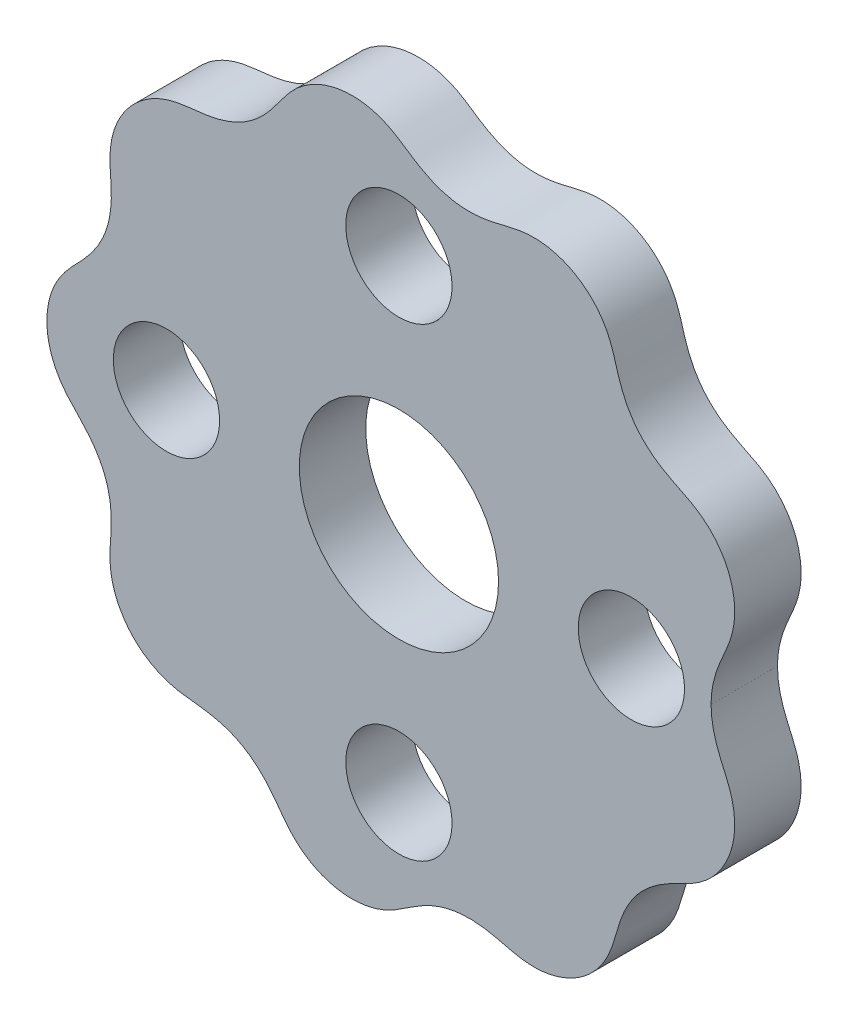
ISO-10303-21;
HEADER;
FILE_DESCRIPTION(('STEP AP214'),'2;1');
FILE_NAME('part.step','',(''),(''),'','','');
FILE_SCHEMA(('AUTOMOTIVE_DESIGN { 1 0 10303 214 1 1 1 1 }'));
ENDSEC;
DATA;
#1=APPLICATION_CONTEXT('core data for automotive mechanical design processes');
#2=APPLICATION_PROTOCOL_DEFINITION('international standard','automotive_design',2000,#1);
#3=PRODUCT_CONTEXT('',#1,'mechanical');
#4=PRODUCT('Part','Part','',(#3));
#5=PRODUCT_RELATED_PRODUCT_CATEGORY('part','',(#4));
#6=PRODUCT_DEFINITION_FORMATION('','',#4);
#7=PRODUCT_DEFINITION_CONTEXT('part definition',#1,'design');
#8=PRODUCT_DEFINITION('design','',#6,#7);
#9=PRODUCT_DEFINITION_SHAPE('','',#8);
#10=(LENGTH_UNIT() NAMED_UNIT(*) SI_UNIT(.MILLI.,.METRE.));
#11=(NAMED_UNIT(*) PLANE_ANGLE_UNIT() SI_UNIT($,.RADIAN.));
#12=(NAMED_UNIT(*) SI_UNIT($,.STERADIAN.) SOLID_ANGLE_UNIT());
#13=UNCERTAINTY_MEASURE_WITH_UNIT(LENGTH_MEASURE(1.E-05),#10,'distance_accuracy_value','');
#14=(GEOMETRIC_REPRESENTATION_CONTEXT(3) GLOBAL_UNCERTAINTY_ASSIGNED_CONTEXT((#13)) GLOBAL_UNIT_ASSIGNED_CONTEXT((#10,
#11,#12)) REPRESENTATION_CONTEXT('',''));
#15=CARTESIAN_POINT('',(0.,0.,0.));
#16=DIRECTION('',(0.,0.,1.));
#17=DIRECTION('',(1.,0.,0.));
#18=AXIS2_PLACEMENT_3D('',#15,#16,#17);
#19=CARTESIAN_POINT('',(23.5,-2.85532179002424E-10,5.));
#20=CARTESIAN_POINT('',(23.5000000000013,-0.0228576602185279,5.));
#21=CARTESIAN_POINT('',(23.500277944134,-0.0689532507761122,5.));
#22=CARTESIAN_POINT('',(23.5015286931378,-0.147874511875441,5.));
#23=CARTESIAN_POINT('',(23.5048623991018,-0.2640072373961,5.));
#24=CARTESIAN_POINT('',(23.5111080084159,-0.40410121197103,5.));
#25=CARTESIAN_POINT('',(23.5219184967929,-0.561913409662999,5.));
#26=CARTESIAN_POINT('',(23.5393374678617,-0.747568025941055,5.));
#27=CARTESIAN_POINT('',(23.5657576126593,-0.960995006870394,5.));
#28=CARTESIAN_POINT('',(23.6067881962687,-1.22521138131373,5.));
#29=CARTESIAN_POINT('',(23.6685598697958,-1.5407242197871,5.));
#30=CARTESIAN_POINT('',(23.7581606962447,-1.90471442940793,5.));
#31=CARTESIAN_POINT('',(23.8826853029305,-2.31478757363593,5.));
#32=CARTESIAN_POINT('',(24.026632957418,-2.71828762328176,5.));
#33=CARTESIAN_POINT('',(24.1863594257245,-3.11573633870416,5.));
#34=CARTESIAN_POINT('',(24.3568503584727,-3.50852259781181,5.));
#35=CARTESIAN_POINT('',(24.531600900479,-3.89934174850835,5.));
#36=CARTESIAN_POINT('',(24.7023289185217,-4.29190635151781,5.));
#37=CARTESIAN_POINT('',(24.90019527676,-4.78919393908537,5.));
#38=CARTESIAN_POINT('',(25.0976080698223,-5.40102362758973,5.));
#39=CARTESIAN_POINT('',(25.2716971705647,-6.24868272332975,5.));
#40=CARTESIAN_POINT('',(25.3120087877986,-7.33673515605263,5.));
#41=CARTESIAN_POINT('',(25.1300390783012,-8.52343565821792,5.));
#42=CARTESIAN_POINT('',(24.6680189566183,-9.74871948797576,5.));
#43=CARTESIAN_POINT('',(24.0206236606056,-10.762889008474,5.));
#44=CARTESIAN_POINT('',(23.2685826624673,-11.5580257549674,5.));
#45=CARTESIAN_POINT('',(22.477396705016,-12.1546902618849,5.));
#46=CARTESIAN_POINT('',(21.703688444983,-12.5910212963116,5.));
#47=CARTESIAN_POINT('',(20.9153884778174,-12.9633543487414,5.));
#48=CARTESIAN_POINT('',(20.1498846517985,-13.3511648814273,5.));
#49=CARTESIAN_POINT('',(19.2529764446328,-13.9005571694372,5.));
#50=CARTESIAN_POINT('',(18.444614687503,-14.5665585820026,5.));
#51=CARTESIAN_POINT('',(17.7509017601407,-15.3610248583065,5.));
#52=CARTESIAN_POINT('',(17.1933308905868,-16.2590034548591,5.));
#53=CARTESIAN_POINT('',(16.829832377832,-17.0332692458518,5.));
#54=CARTESIAN_POINT('',(16.5468734720692,-17.8351697492656,5.));
#55=CARTESIAN_POINT('',(16.3173320116354,-18.6484384749294,5.));
#56=CARTESIAN_POINT('',(16.083119508705,-19.4562250040876,5.));
#57=CARTESIAN_POINT('',(15.7759109952018,-20.2364705559296,5.));
#58=CARTESIAN_POINT('',(15.3147720256646,-21.0705149493729,5.));
#59=CARTESIAN_POINT('',(14.6530809961106,-21.9102654183807,5.));
#60=CARTESIAN_POINT('',(13.7596827174511,-22.6898468421099,5.));
#61=CARTESIAN_POINT('',(12.6260893272668,-23.3255913764911,5.));
#62=CARTESIAN_POINT('',(11.4828857995772,-23.6849483969662,5.));
#63=CARTESIAN_POINT('',(10.3956923296389,-23.8107092359673,5.));
#64=CARTESIAN_POINT('',(9.40607638735225,-23.7592582434995,5.));
#65=CARTESIAN_POINT('',(8.53290708505048,-23.5962096515787,5.));
#66=CARTESIAN_POINT('',(7.68970090136431,-23.3747280239397,5.));
#67=CARTESIAN_POINT('',(6.85401581546435,-23.1797357984442,5.));
#68=CARTESIAN_POINT('',(5.81380706777841,-23.0240401688487,5.));
#69=CARTESIAN_POINT('',(4.7664699328054,-23.0145809149435,5.));
#70=CARTESIAN_POINT('',(3.7243753083592,-23.1772244763756,5.));
#71=CARTESIAN_POINT('',(2.72002875473677,-23.5066766871146,5.));
#72=CARTESIAN_POINT('',(1.94387089813525,-23.8661186018533,5.));
#73=CARTESIAN_POINT('',(1.2116476823706,-24.2985073105749,5.));
#74=CARTESIAN_POINT('',(0.513043619289276,-24.7739526755351,5.));
#75=CARTESIAN_POINT('',(-0.185599795164596,-25.2422165021426,5.));
#76=CARTESIAN_POINT('',(-0.922450857509873,-25.6424784952624,5.));
#77=CARTESIAN_POINT('',(-1.81180162606078,-25.9850192060294,5.));
#78=CARTESIAN_POINT('',(-2.8584575311366,-26.2030265473097,5.));
#79=CARTESIAN_POINT('',(-4.04394465441829,-26.2260081908159,5.));
#80=CARTESIAN_POINT('',(-5.32098698937089,-25.9844135547731,5.));
#81=CARTESIAN_POINT('',(-6.42774251005763,-25.5249095304962,5.));
#82=CARTESIAN_POINT('',(-7.3414463515038,-24.9224552968198,5.));
#83=CARTESIAN_POINT('',(-8.06649449137152,-24.2469607475206,5.));
#84=CARTESIAN_POINT('',(-8.63060069272589,-23.5608152478343,5.));
#85=CARTESIAN_POINT('',(-9.13417313386342,-22.849150757669,5.));
#86=CARTESIAN_POINT('',(-9.6489925016639,-22.1626002156509,5.));
#87=CARTESIAN_POINT('',(-10.3457341317353,-21.3746755964519,5.));
#88=CARTESIAN_POINT('',(-11.141933187009,-20.6941833036861,5.));
#89=CARTESIAN_POINT('',(-12.0447468035776,-20.1488930463781,5.));
#90=CARTESIAN_POINT('',(-13.0258731273161,-19.7556477708038,5.));
#91=CARTESIAN_POINT('',(-13.8514817733573,-19.5320617815865,5.));
#92=CARTESIAN_POINT('',(-14.6903278944324,-19.3926032221238,5.));
#93=CARTESIAN_POINT('',(-15.5310993965593,-19.3077513020698,5.));
#94=CARTESIAN_POINT('',(-16.3672865644551,-19.2173980554534,5.));
#95=CARTESIAN_POINT('',(-17.1890367193428,-19.0504106514745,5.));
#96=CARTESIAN_POINT('',(-18.0905136675845,-18.7411890985239,5.));
#97=CARTESIAN_POINT('',(-19.0324541676068,-18.2354581490495,5.));
#98=CARTESIAN_POINT('',(-19.9553956301612,-17.4910878593717,5.));
#99=CARTESIAN_POINT('',(-20.7784173473519,-16.4851851049366,5.));
#100=CARTESIAN_POINT('',(-21.3309254029547,-15.4218006320367,5.));
#101=CARTESIAN_POINT('',(-21.6436612553693,-14.3729905999235,5.));
#102=CARTESIAN_POINT('',(-21.7649247309557,-13.3894848123636,5.));
#103=CARTESIAN_POINT('',(-21.756041186056,-12.501264955123,5.));
#104=CARTESIAN_POINT('',(-21.6843563097444,-11.6324073147103,5.));
#105=CARTESIAN_POINT('',(-21.63740764576,-10.7755610346151,5.));
#106=CARTESIAN_POINT('',(-21.6646413010805,-9.72411861231148,5.));
#107=CARTESIAN_POINT('',(-21.8371123581809,-8.6910384734588,5.));
#108=CARTESIAN_POINT('',(-22.1781609506279,-7.69299062650923,5.));
#109=CARTESIAN_POINT('',(-22.6769372639453,-6.7610717187126,5.));
#110=CARTESIAN_POINT('',(-23.1656469046157,-6.05908593355684,5.));
#111=CARTESIAN_POINT('',(-23.718580273759,-5.41303882492929,5.));
#112=CARTESIAN_POINT('',(-24.3080998140085,-4.80759360441762,5.));
#113=CARTESIAN_POINT('',(-24.8905889769942,-4.20089918250406,5.));
#114=CARTESIAN_POINT('',(-25.4127744263289,-3.54478987372398,5.));
#115=CARTESIAN_POINT('',(-25.9046187845915,-2.72847650686677,5.));
#116=CARTESIAN_POINT('',(-26.3011549687771,-1.73561464959699,5.));
#117=CARTESIAN_POINT('',(-26.5297491482424,-0.572148720356917,5.));
#118=CARTESIAN_POINT('',(-26.5136961165557,0.727446371765913,5.));
#119=CARTESIAN_POINT('',(-26.2534638877157,1.89720311292766,5.));
#120=CARTESIAN_POINT('',(-25.8189174184263,2.90168106002261,5.));
#121=CARTESIAN_POINT('',(-25.2796621560614,3.73306123766129,5.));
#122=CARTESIAN_POINT('',(-24.7019437365322,4.40778847056527,5.));
#123=CARTESIAN_POINT('',(-24.0885425599656,5.02729802522093,5.));
#124=CARTESIAN_POINT('',(-23.5017955446355,5.65349029645332,5.));
#125=CARTESIAN_POINT('',(-22.8467779654582,6.47642622538457,5.));
#126=CARTESIAN_POINT('',(-22.314812301561,7.37865209086576,5.));
#127=CARTESIAN_POINT('',(-21.9344976141092,8.36240721363327,5.));
#128=CARTESIAN_POINT('',(-21.7175156032928,9.3968971461826,5.));
#129=CARTESIAN_POINT('',(-21.6406304597102,10.2487836741179,5.));
#130=CARTESIAN_POINT('',(-21.6489071432778,11.0991038182542,5.));
#131=CARTESIAN_POINT('',(-21.7113224900404,11.9418387500397,5.));
#132=CARTESIAN_POINT('',(-21.76757453961,12.7810088828096,5.));
#133=CARTESIAN_POINT('',(-21.7458862646175,13.6192723528486,5.));
#134=CARTESIAN_POINT('',(-21.5979872571828,14.5607626595361,5.));
#135=CARTESIAN_POINT('',(-21.263598847671,15.5762428014002,5.));
#136=CARTESIAN_POINT('',(-20.6908970129919,16.6144725793168,5.));
#137=CARTESIAN_POINT('',(-19.8432797075705,17.5997390467367,5.));
#138=CARTESIAN_POINT('',(-18.8920577809222,18.3285932504634,5.));
#139=CARTESIAN_POINT('',(-17.9135322497994,18.8187919331052,5.));
#140=CARTESIAN_POINT('',(-16.9660504467118,19.1090818628769,5.));
#141=CARTESIAN_POINT('',(-16.0897902815445,19.2546343030575,5.));
#142=CARTESIAN_POINT('',(-15.2216847139809,19.3349249400297,5.));
#143=CARTESIAN_POINT('',(-14.3697002773554,19.4374453541976,5.));
#144=CARTESIAN_POINT('',(-13.338948663889,19.6467810038805,5.));
#145=CARTESIAN_POINT('',(-12.3514868153261,19.995946032217,5.));
#146=CARTESIAN_POINT('',(-11.4277824941948,20.5050466957983,5.));
#147=CARTESIAN_POINT('',(-10.5965815129868,21.1580057259962,5.));
#148=CARTESIAN_POINT('',(-9.99007993297758,21.7611463757944,5.));
#149=CARTESIAN_POINT('',(-9.44982636917672,22.4178347437854,5.));
#150=CARTESIAN_POINT('',(-8.95593123120548,23.1035213135598,5.));
#151=CARTESIAN_POINT('',(-8.45962722528247,23.7825295589756,5.));
#152=CARTESIAN_POINT('',(-7.90421309696735,24.4107573281332,5.));
#153=CARTESIAN_POINT('',(-7.18576592107424,25.0369453968779,5.));
#154=CARTESIAN_POINT('',(-6.27689732010906,25.5999492217831,5.));
#155=CARTESIAN_POINT('',(-5.17084003670636,26.0272031798904,5.));
#156=CARTESIAN_POINT('',(-3.88821973300646,26.2371800114962,5.));
#157=CARTESIAN_POINT('',(-2.69104065059583,26.1841346896721,5.));
#158=CARTESIAN_POINT('',(-1.62634115527189,25.9307134365046,5.));
#159=CARTESIAN_POINT('',(-0.713915614566088,25.5440993969373,5.));
#160=CARTESIAN_POINT('',(0.0509150969181294,25.0923767481923,5.));
#161=CARTESIAN_POINT('',(0.767535838765334,24.5958796722366,5.));
#162=CARTESIAN_POINT('',(1.48608287764124,24.1267558476684,5.));
#163=CARTESIAN_POINT('',(2.41022640044032,23.624533007838,5.));
#164=CARTESIAN_POINT('',(3.3910897346818,23.2572424187209,5.));
#165=CARTESIAN_POINT('',(4.42592343013432,23.0534480706579,5.));
#166=CARTESIAN_POINT('',(5.48237292604747,23.019316233979,5.));
#167=CARTESIAN_POINT('',(6.33467450700515,23.0914664592926,5.));
#168=CARTESIAN_POINT('',(7.17064864184643,23.2472273271117,5.));
#169=CARTESIAN_POINT('',(7.9897479745291,23.4550142412078,5.));
#170=CARTESIAN_POINT('',(8.80639281598789,23.6561612687686,5.));
#171=CARTESIAN_POINT('',(9.63567618573065,23.7804312664824,5.));
#172=CARTESIAN_POINT('',(10.588543635537,23.7983531734531,5.));
#173=CARTESIAN_POINT('',(11.6466762251453,23.6454781490831,5.));
#174=CARTESIAN_POINT('',(12.768616033519,23.2618638526685,5.));
#175=CARTESIAN_POINT('',(13.8861600944304,22.5983125155836,5.));
#176=CARTESIAN_POINT('',(14.7691918904672,21.7881851276748,5.));
#177=CARTESIAN_POINT('',(15.4219434203031,20.9097073843081,5.));
#178=CARTESIAN_POINT('',(15.8724307785678,20.0270677468563,5.));
#179=CARTESIAN_POINT('',(16.167993782495,19.1894139989655,5.));
#180=CARTESIAN_POINT('',(16.3978204091769,18.3484412135686,5.));
#181=CARTESIAN_POINT('',(16.6466958204097,17.5271940098169,5.));
#182=CARTESIAN_POINT('',(17.0317772982674,16.5484292864081,5.));
#183=CARTESIAN_POINT('',(17.5470357239491,15.6365622538959,5.));
#184=CARTESIAN_POINT('',(18.2087345944245,14.8152411582572,5.));
#185=CARTESIAN_POINT('',(18.9960537520868,14.1099912477742,5.));
#186=CARTESIAN_POINT('',(19.6953158105069,13.6173865398173,5.));
#187=CARTESIAN_POINT('',(20.43581659158,13.1993328337165,5.));
#188=CARTESIAN_POINT('',(21.1968459774471,12.8319883566646,5.));
#189=CARTESIAN_POINT('',(21.9517265717591,12.4611641705687,5.));
#190=CARTESIAN_POINT('',(22.66689989049,12.0233312356971,5.));
#191=CARTESIAN_POINT('',(23.408372005398,11.4246096434162,5.));
#192=CARTESIAN_POINT('',(24.1207412503847,10.6273667219236,5.));
#193=CARTESIAN_POINT('',(24.7325053380232,9.61423041002227,5.));
#194=CARTESIAN_POINT('',(25.1612897872621,8.39189714861539,5.));
#195=CARTESIAN_POINT('',(25.3171247783565,7.21501883843547,5.));
#196=CARTESIAN_POINT('',(25.263781672727,6.24790347653213,5.));
#197=CARTESIAN_POINT('',(25.1175040764233,5.510438712453,5.));
#198=CARTESIAN_POINT('',(24.966955870786,4.99420666307445,5.));
#199=CARTESIAN_POINT('',(24.822456983055,4.58905816128158,5.));
#200=CARTESIAN_POINT('',(24.6799190531077,4.24084518133747,5.));
#201=CARTESIAN_POINT('',(24.5297317133017,3.89593731060575,5.));
#202=CARTESIAN_POINT('',(24.3985598684211,3.60138597871073,5.));
#203=CARTESIAN_POINT('',(24.2702647871733,3.31009025448884,5.));
#204=CARTESIAN_POINT('',(24.1274224470537,2.97103051972237,5.));
#205=CARTESIAN_POINT('',(23.9945797013699,2.63234361984571,5.));
#206=CARTESIAN_POINT('',(23.859134168431,2.24164098667746,5.));
#207=CARTESIAN_POINT('',(23.7422881735064,1.84501623494856,5.));
#208=CARTESIAN_POINT('',(23.6463350000019,1.44267663523627,5.));
#209=CARTESIAN_POINT('',(23.5821144301795,1.08664955456257,5.));
#210=CARTESIAN_POINT('',(23.5419011562417,0.779128174147556,5.));
#211=CARTESIAN_POINT('',(23.5185118306408,0.520791518084868,5.));
#212=CARTESIAN_POINT('',(23.5059524395842,0.32448427393776,5.));
#213=CARTESIAN_POINT('',(23.5011423942434,0.136389089674997,5.));
#214=CARTESIAN_POINT('',(23.500037495064,0.0496188607152907,5.));
#215=CARTESIAN_POINT('',(23.500002199997,0.0054999961733198,5.));
#216=B_SPLINE_CURVE_WITH_KNOTS('',4,(#19,#20,#21,#22,#23,#24,#25,#26,#27,#28,#29,#30,#31,#32,
#33,#34,#35,#36,#37,#38,#39,#40,#41,#42,#43,#44,#45,#46,#47,#48,#49,#50,#51,#52,#53,#54,#55,#56,
#57,#58,#59,#60,#61,#62,#63,#64,#65,#66,#67,#68,#69,#70,#71,#72,#73,#74,#75,#76,#77,#78,#79,#80,
#81,#82,#83,#84,#85,#86,#87,#88,#89,#90,#91,#92,#93,#94,#95,#96,#97,#98,#99,#100,#101,#102,#103,
#104,#105,#106,#107,#108,#109,#110,#111,#112,#113,#114,#115,#116,#117,#118,#119,#120,#121,#122,
#123,#124,#125,#126,#127,#128,#129,#130,#131,#132,#133,#134,#135,#136,#137,#138,#139,#140,#141,
#142,#143,#144,#145,#146,#147,#148,#149,#150,#151,#152,#153,#154,#155,#156,#157,#158,#159,#160,
#161,#162,#163,#164,#165,#166,#167,#168,#169,#170,#171,#172,#173,#174,#175,#176,#177,#178,#179,
#180,#181,#182,#183,#184,#185,#186,#187,#188,#189,#190,#191,#192,#193,#194,#195,#196,#197,#198,
#199,#200,#201,#202,#203,#204,#205,#206,#207,#208,#209,#210,#211,#212,#213,#214,#215),
.UNSPECIFIED.,.F.,.F.,(5,1,1,1,1,1,1,1,1,1,1,1,1,1,1,1,1,1,1,1,1,1,1,1,1,1,1,1,1,1,1,1,1,1,1,1,
1,1,1,1,1,1,1,1,1,1,1,1,1,1,1,1,1,1,1,1,1,1,1,1,1,1,1,1,1,1,1,1,1,1,1,1,1,1,1,1,1,1,1,1,1,1,1,1,
1,1,1,1,1,1,1,1,1,1,1,1,1,1,1,1,1,1,1,1,1,1,1,1,1,1,1,1,1,1,1,1,1,1,1,1,1,1,1,1,1,1,1,1,1,1,1,1,
1,1,1,1,1,1,1,1,1,1,1,1,1,1,1,1,1,1,1,1,1,1,1,1,1,1,1,1,1,1,1,1,1,1,1,1,1,1,1,1,1,1,1,1,1,1,1,1,
1,1,1,1,1,1,1,1,1,1,1,1,1,5),(0.0730488149762622,0.0735896640523672,0.0741305131284722,
0.0746713622045773,0.0752122112806823,0.0762939094328924,0.0773756075851024,0.0784573057373124,
0.0795390038895225,0.0817024001939426,0.0838657964983627,0.0860291928027828,0.0881925891072029,
0.090355985411623,0.0925181323554636,0.0946802792993041,0.0968424262431447,0.0990045731869853,
0.103328867074666,0.107653160962348,0.114269271232537,0.120885381502726,0.127404675372498,
0.133923969242269,0.138401533092194,0.142879096942119,0.147356660792043,0.151834224641968,
0.156020278880653,0.160206333119339,0.16857844159671,0.172889823226748,0.177201204856786,
0.181512586486823,0.185823968116861,0.190049493860116,0.194275019603371,0.198500545346626,
0.202726071089881,0.209245205996877,0.215764340903873,0.222283634541896,0.228802928179919,
0.233280494002604,0.237758059825289,0.242235625647975,0.24671319147066,0.250899243188804,
0.255085294906948,0.263457398343237,0.267768781273424,0.27208016420361,0.276391547133796,
0.280702930063983,0.284928455009042,0.289153979954102,0.293379504899161,0.297605029844221,
0.304124165073199,0.310643300302177,0.317162593708238,0.323681887114299,0.328159454909849,
0.332637022705399,0.337114590500948,0.341592158296498,0.345778207489373,0.349964256682248,
0.358336355067997,0.362647739303797,0.366959123539597,0.371270507775397,0.375581892011197,
0.379807416157375,0.384032940303553,0.38825846444973,0.392483988595908,0.399003124146761,
0.405522259697614,0.412041552871499,0.418560846045384,0.423038415813899,0.427515985582415,
0.431993555350931,0.436471125119446,0.44065717178235,0.444843218445254,0.453215311771063,
0.457526697317917,0.461838082864771,0.466149468411625,0.470460853958479,0.47468637730509,
0.478911900651701,0.483137423998312,0.487362947344923,0.493882083217541,0.500401219090159,
0.506920512031654,0.513439804973149,0.517917376714729,0.522394948456309,0.526872520197889,
0.531350091939469,0.535536136067729,0.539722180195988,0.548094268452507,0.552405655315831,
0.556717042179155,0.561028429042479,0.565339815905803,0.569565338452162,0.573790860998521,
0.57801638354488,0.582241906091239,0.588761042285514,0.595280178479789,0.601799471188682,
0.608318763897574,0.612796337612314,0.617273911327054,0.621751485041794,0.626229058756534,
0.630415100345502,0.634601141934469,0.642973225112404,0.647284613297589,0.651596001482774,
0.655907389667959,0.660218777853145,0.664444299598566,0.668669821343988,0.67289534308941,
0.677120864834831,0.683640001350657,0.690159137866482,0.696678430342558,0.703197722818634,
0.707675298506627,0.71215287419462,0.716630449882614,0.721108025570607,0.725294064615662,
0.729480103660718,0.737852181750829,0.742163571263242,0.746474960775656,0.750786350288069,
0.755097739800483,0.759323260744283,0.763548781688083,0.767774302631883,0.771999823575683,
0.778518960412948,0.785038097250213,0.79155738949326,0.798076681736307,0.802554259397644,
0.807031837058981,0.811509414720317,0.815986992381654,0.820173028878204,0.824359065374754,
0.832731138367855,0.837042529212839,0.841353920057823,0.845665310902807,0.849976701747791,
0.854202221889285,0.858427742030779,0.862653262172273,0.866878782313767,0.873397919472362,
0.879917056630957,0.886392972332832,0.892868888034706,0.89721204281108,0.899383620199267,
0.901555197587454,0.903726774975641,0.905898352363828,0.906984141057921,0.909155718446108,
0.910241507140201,0.912329354694092,0.914417202247983,0.916505049801874,0.918592897355764,
0.920680744909655,0.922768592463546,0.923812516240491,0.924856440017436,0.925900363794382,
0.926944287584438),.UNSPECIFIED.);
#217=DIRECTION('',(0.,0.,-1.));
#218=VECTOR('',#217,1.);
#219=SURFACE_OF_LINEAR_EXTRUSION('',#216,#218);
#220=CARTESIAN_POINT('',(23.5,-2.85532179002424E-10,0.));
#221=CARTESIAN_POINT('',(23.5000000000013,-0.0228576602185279,0.));
#222=CARTESIAN_POINT('',(23.500277944134,-0.0689532507761122,0.));
#223=CARTESIAN_POINT('',(23.5015286931378,-0.147874511875441,0.));
#224=CARTESIAN_POINT('',(23.5048623991018,-0.2640072373961,0.));
#225=CARTESIAN_POINT('',(23.5111080084159,-0.40410121197103,0.));
#226=CARTESIAN_POINT('',(23.5219184967929,-0.561913409662999,0.));
#227=CARTESIAN_POINT('',(23.5393374678617,-0.747568025941055,0.));
#228=CARTESIAN_POINT('',(23.5657576126593,-0.960995006870394,0.));
#229=CARTESIAN_POINT('',(23.6067881962687,-1.22521138131373,0.));
#230=CARTESIAN_POINT('',(23.6685598697958,-1.5407242197871,0.));
#231=CARTESIAN_POINT('',(23.7581606962447,-1.90471442940793,0.));
#232=CARTESIAN_POINT('',(23.8826853029305,-2.31478757363593,0.));
#233=CARTESIAN_POINT('',(24.026632957418,-2.71828762328176,0.));
#234=CARTESIAN_POINT('',(24.1863594257245,-3.11573633870416,0.));
#235=CARTESIAN_POINT('',(24.3568503584727,-3.50852259781181,0.));
#236=CARTESIAN_POINT('',(24.531600900479,-3.89934174850835,0.));
#237=CARTESIAN_POINT('',(24.7023289185217,-4.29190635151781,0.));
#238=CARTESIAN_POINT('',(24.90019527676,-4.78919393908537,0.));
#239=CARTESIAN_POINT('',(25.0976080698223,-5.40102362758973,0.));
#240=CARTESIAN_POINT('',(25.2716971705647,-6.24868272332975,0.));
#241=CARTESIAN_POINT('',(25.3120087877986,-7.33673515605263,0.));
#242=CARTESIAN_POINT('',(25.1300390783012,-8.52343565821792,0.));
#243=CARTESIAN_POINT('',(24.6680189566183,-9.74871948797576,0.));
#244=CARTESIAN_POINT('',(24.0206236606056,-10.762889008474,0.));
#245=CARTESIAN_POINT('',(23.2685826624673,-11.5580257549674,0.));
#246=CARTESIAN_POINT('',(22.477396705016,-12.1546902618849,0.));
#247=CARTESIAN_POINT('',(21.703688444983,-12.5910212963116,0.));
#248=CARTESIAN_POINT('',(20.9153884778174,-12.9633543487414,0.));
#249=CARTESIAN_POINT('',(20.1498846517985,-13.3511648814273,0.));
#250=CARTESIAN_POINT('',(19.2529764446328,-13.9005571694372,0.));
#251=CARTESIAN_POINT('',(18.444614687503,-14.5665585820026,0.));
#252=CARTESIAN_POINT('',(17.7509017601407,-15.3610248583065,0.));
#253=CARTESIAN_POINT('',(17.1933308905868,-16.2590034548591,0.));
#254=CARTESIAN_POINT('',(16.829832377832,-17.0332692458518,0.));
#255=CARTESIAN_POINT('',(16.5468734720692,-17.8351697492656,0.));
#256=CARTESIAN_POINT('',(16.3173320116354,-18.6484384749294,0.));
#257=CARTESIAN_POINT('',(16.083119508705,-19.4562250040876,0.));
#258=CARTESIAN_POINT('',(15.7759109952018,-20.2364705559296,0.));
#259=CARTESIAN_POINT('',(15.3147720256646,-21.0705149493729,0.));
#260=CARTESIAN_POINT('',(14.6530809961106,-21.9102654183807,0.));
#261=CARTESIAN_POINT('',(13.7596827174511,-22.6898468421099,0.));
#262=CARTESIAN_POINT('',(12.6260893272668,-23.3255913764911,0.));
#263=CARTESIAN_POINT('',(11.4828857995772,-23.6849483969662,0.));
#264=CARTESIAN_POINT('',(10.3956923296389,-23.8107092359673,0.));
#265=CARTESIAN_POINT('',(9.40607638735225,-23.7592582434995,0.));
#266=CARTESIAN_POINT('',(8.53290708505048,-23.5962096515787,0.));
#267=CARTESIAN_POINT('',(7.68970090136431,-23.3747280239397,0.));
#268=CARTESIAN_POINT('',(6.85401581546435,-23.1797357984442,0.));
#269=CARTESIAN_POINT('',(5.81380706777841,-23.0240401688487,0.));
#270=CARTESIAN_POINT('',(4.7664699328054,-23.0145809149435,0.));
#271=CARTESIAN_POINT('',(3.7243753083592,-23.1772244763756,0.));
#272=CARTESIAN_POINT('',(2.72002875473677,-23.5066766871146,0.));
#273=CARTESIAN_POINT('',(1.94387089813525,-23.8661186018533,0.));
#274=CARTESIAN_POINT('',(1.2116476823706,-24.2985073105749,0.));
#275=CARTESIAN_POINT('',(0.513043619289276,-24.7739526755351,0.));
#276=CARTESIAN_POINT('',(-0.185599795164596,-25.2422165021426,0.));
#277=CARTESIAN_POINT('',(-0.922450857509873,-25.6424784952624,0.));
#278=CARTESIAN_POINT('',(-1.81180162606078,-25.9850192060294,0.));
#279=CARTESIAN_POINT('',(-2.8584575311366,-26.2030265473097,0.));
#280=CARTESIAN_POINT('',(-4.04394465441829,-26.2260081908159,0.));
#281=CARTESIAN_POINT('',(-5.32098698937089,-25.9844135547731,0.));
#282=CARTESIAN_POINT('',(-6.42774251005763,-25.5249095304962,0.));
#283=CARTESIAN_POINT('',(-7.3414463515038,-24.9224552968198,0.));
#284=CARTESIAN_POINT('',(-8.06649449137152,-24.2469607475206,0.));
#285=CARTESIAN_POINT('',(-8.63060069272589,-23.5608152478343,0.));
#286=CARTESIAN_POINT('',(-9.13417313386342,-22.849150757669,0.));
#287=CARTESIAN_POINT('',(-9.6489925016639,-22.1626002156509,0.));
#288=CARTESIAN_POINT('',(-10.3457341317353,-21.3746755964519,0.));
#289=CARTESIAN_POINT('',(-11.141933187009,-20.6941833036861,0.));
#290=CARTESIAN_POINT('',(-12.0447468035776,-20.1488930463781,0.));
#291=CARTESIAN_POINT('',(-13.0258731273161,-19.7556477708038,0.));
#292=CARTESIAN_POINT('',(-13.8514817733573,-19.5320617815865,0.));
#293=CARTESIAN_POINT('',(-14.6903278944324,-19.3926032221238,0.));
#294=CARTESIAN_POINT('',(-15.5310993965593,-19.3077513020698,0.));
#295=CARTESIAN_POINT('',(-16.3672865644551,-19.2173980554534,0.));
#296=CARTESIAN_POINT('',(-17.1890367193428,-19.0504106514745,0.));
#297=CARTESIAN_POINT('',(-18.0905136675845,-18.7411890985239,0.));
#298=CARTESIAN_POINT('',(-19.0324541676068,-18.2354581490495,0.));
#299=CARTESIAN_POINT('',(-19.9553956301612,-17.4910878593717,0.));
#300=CARTESIAN_POINT('',(-20.7784173473519,-16.4851851049366,0.));
#301=CARTESIAN_POINT('',(-21.3309254029547,-15.4218006320367,0.));
#302=CARTESIAN_POINT('',(-21.6436612553693,-14.3729905999235,0.));
#303=CARTESIAN_POINT('',(-21.7649247309557,-13.3894848123636,0.));
#304=CARTESIAN_POINT('',(-21.756041186056,-12.501264955123,0.));
#305=CARTESIAN_POINT('',(-21.6843563097444,-11.6324073147103,0.));
#306=CARTESIAN_POINT('',(-21.63740764576,-10.7755610346151,0.));
#307=CARTESIAN_POINT('',(-21.6646413010805,-9.72411861231148,0.));
#308=CARTESIAN_POINT('',(-21.8371123581809,-8.6910384734588,0.));
#309=CARTESIAN_POINT('',(-22.1781609506279,-7.69299062650923,0.));
#310=CARTESIAN_POINT('',(-22.6769372639453,-6.7610717187126,0.));
#311=CARTESIAN_POINT('',(-23.1656469046157,-6.05908593355684,0.));
#312=CARTESIAN_POINT('',(-23.718580273759,-5.41303882492929,0.));
#313=CARTESIAN_POINT('',(-24.3080998140085,-4.80759360441762,0.));
#314=CARTESIAN_POINT('',(-24.8905889769942,-4.20089918250406,0.));
#315=CARTESIAN_POINT('',(-25.4127744263289,-3.54478987372398,0.));
#316=CARTESIAN_POINT('',(-25.9046187845915,-2.72847650686677,0.));
#317=CARTESIAN_POINT('',(-26.3011549687771,-1.73561464959699,0.));
#318=CARTESIAN_POINT('',(-26.5297491482424,-0.572148720356917,0.));
#319=CARTESIAN_POINT('',(-26.5136961165557,0.727446371765913,0.));
#320=CARTESIAN_POINT('',(-26.2534638877157,1.89720311292766,0.));
#321=CARTESIAN_POINT('',(-25.8189174184263,2.90168106002261,0.));
#322=CARTESIAN_POINT('',(-25.2796621560614,3.73306123766129,0.));
#323=CARTESIAN_POINT('',(-24.7019437365322,4.40778847056527,0.));
#324=CARTESIAN_POINT('',(-24.0885425599656,5.02729802522093,0.));
#325=CARTESIAN_POINT('',(-23.5017955446355,5.65349029645332,0.));
#326=CARTESIAN_POINT('',(-22.8467779654582,6.47642622538457,0.));
#327=CARTESIAN_POINT('',(-22.314812301561,7.37865209086576,0.));
#328=CARTESIAN_POINT('',(-21.9344976141092,8.36240721363327,0.));
#329=CARTESIAN_POINT('',(-21.7175156032928,9.3968971461826,0.));
#330=CARTESIAN_POINT('',(-21.6406304597102,10.2487836741179,0.));
#331=CARTESIAN_POINT('',(-21.6489071432778,11.0991038182542,0.));
#332=CARTESIAN_POINT('',(-21.7113224900404,11.9418387500397,0.));
#333=CARTESIAN_POINT('',(-21.76757453961,12.7810088828096,0.));
#334=CARTESIAN_POINT('',(-21.7458862646175,13.6192723528486,0.));
#335=CARTESIAN_POINT('',(-21.5979872571828,14.5607626595361,0.));
#336=CARTESIAN_POINT('',(-21.263598847671,15.5762428014002,0.));
#337=CARTESIAN_POINT('',(-20.6908970129919,16.6144725793168,0.));
#338=CARTESIAN_POINT('',(-19.8432797075705,17.5997390467367,0.));
#339=CARTESIAN_POINT('',(-18.8920577809222,18.3285932504634,0.));
#340=CARTESIAN_POINT('',(-17.9135322497994,18.8187919331052,0.));
#341=CARTESIAN_POINT('',(-16.9660504467118,19.1090818628769,0.));
#342=CARTESIAN_POINT('',(-16.0897902815445,19.2546343030575,0.));
#343=CARTESIAN_POINT('',(-15.2216847139809,19.3349249400297,0.));
#344=CARTESIAN_POINT('',(-14.3697002773554,19.4374453541976,0.));
#345=CARTESIAN_POINT('',(-13.338948663889,19.6467810038805,0.));
#346=CARTESIAN_POINT('',(-12.3514868153261,19.995946032217,0.));
#347=CARTESIAN_POINT('',(-11.4277824941948,20.5050466957983,0.));
#348=CARTESIAN_POINT('',(-10.5965815129868,21.1580057259962,0.));
#349=CARTESIAN_POINT('',(-9.99007993297758,21.7611463757944,0.));
#350=CARTESIAN_POINT('',(-9.44982636917672,22.4178347437854,0.));
#351=CARTESIAN_POINT('',(-8.95593123120548,23.1035213135598,0.));
#352=CARTESIAN_POINT('',(-8.45962722528247,23.7825295589756,0.));
#353=CARTESIAN_POINT('',(-7.90421309696735,24.4107573281332,0.));
#354=CARTESIAN_POINT('',(-7.18576592107424,25.0369453968779,0.));
#355=CARTESIAN_POINT('',(-6.27689732010906,25.5999492217831,0.));
#356=CARTESIAN_POINT('',(-5.17084003670636,26.0272031798904,0.));
#357=CARTESIAN_POINT('',(-3.88821973300646,26.2371800114962,0.));
#358=CARTESIAN_POINT('',(-2.69104065059583,26.1841346896721,0.));
#359=CARTESIAN_POINT('',(-1.62634115527189,25.9307134365046,0.));
#360=CARTESIAN_POINT('',(-0.713915614566088,25.5440993969373,0.));
#361=CARTESIAN_POINT('',(0.0509150969181294,25.0923767481923,0.));
#362=CARTESIAN_POINT('',(0.767535838765334,24.5958796722366,0.));
#363=CARTESIAN_POINT('',(1.48608287764124,24.1267558476684,0.));
#364=CARTESIAN_POINT('',(2.41022640044032,23.624533007838,0.));
#365=CARTESIAN_POINT('',(3.3910897346818,23.2572424187209,0.));
#366=CARTESIAN_POINT('',(4.42592343013432,23.0534480706579,0.));
#367=CARTESIAN_POINT('',(5.48237292604747,23.019316233979,0.));
#368=CARTESIAN_POINT('',(6.33467450700515,23.0914664592926,0.));
#369=CARTESIAN_POINT('',(7.17064864184643,23.2472273271117,0.));
#370=CARTESIAN_POINT('',(7.9897479745291,23.4550142412078,0.));
#371=CARTESIAN_POINT('',(8.80639281598789,23.6561612687686,0.));
#372=CARTESIAN_POINT('',(9.63567618573065,23.7804312664824,0.));
#373=CARTESIAN_POINT('',(10.588543635537,23.7983531734531,0.));
#374=CARTESIAN_POINT('',(11.6466762251453,23.6454781490831,0.));
#375=CARTESIAN_POINT('',(12.768616033519,23.2618638526685,0.));
#376=CARTESIAN_POINT('',(13.8861600944304,22.5983125155836,0.));
#377=CARTESIAN_POINT('',(14.7691918904672,21.7881851276748,0.));
#378=CARTESIAN_POINT('',(15.4219434203031,20.9097073843081,0.));
#379=CARTESIAN_POINT('',(15.8724307785678,20.0270677468563,0.));
#380=CARTESIAN_POINT('',(16.167993782495,19.1894139989655,0.));
#381=CARTESIAN_POINT('',(16.3978204091769,18.3484412135686,0.));
#382=CARTESIAN_POINT('',(16.6466958204097,17.5271940098169,0.));
#383=CARTESIAN_POINT('',(17.0317772982674,16.5484292864081,0.));
#384=CARTESIAN_POINT('',(17.5470357239491,15.6365622538959,0.));
#385=CARTESIAN_POINT('',(18.2087345944245,14.8152411582572,0.));
#386=CARTESIAN_POINT('',(18.9960537520868,14.1099912477742,0.));
#387=CARTESIAN_POINT('',(19.6953158105069,13.6173865398173,0.));
#388=CARTESIAN_POINT('',(20.43581659158,13.1993328337165,0.));
#389=CARTESIAN_POINT('',(21.1968459774471,12.8319883566646,0.));
#390=CARTESIAN_POINT('',(21.9517265717591,12.4611641705687,0.));
#391=CARTESIAN_POINT('',(22.66689989049,12.0233312356971,0.));
#392=CARTESIAN_POINT('',(23.408372005398,11.4246096434162,0.));
#393=CARTESIAN_POINT('',(24.1207412503847,10.6273667219236,0.));
#394=CARTESIAN_POINT('',(24.7325053380232,9.61423041002227,0.));
#395=CARTESIAN_POINT('',(25.1612897872621,8.39189714861539,0.));
#396=CARTESIAN_POINT('',(25.3171247783565,7.21501883843547,0.));
#397=CARTESIAN_POINT('',(25.263781672727,6.24790347653213,0.));
#398=CARTESIAN_POINT('',(25.1175040764233,5.510438712453,0.));
#399=CARTESIAN_POINT('',(24.966955870786,4.99420666307445,0.));
#400=CARTESIAN_POINT('',(24.822456983055,4.58905816128158,0.));
#401=CARTESIAN_POINT('',(24.6799190531077,4.24084518133747,0.));
#402=CARTESIAN_POINT('',(24.5297317133017,3.89593731060575,0.));
#403=CARTESIAN_POINT('',(24.3985598684211,3.60138597871073,0.));
#404=CARTESIAN_POINT('',(24.2702647871733,3.31009025448884,0.));
#405=CARTESIAN_POINT('',(24.1274224470537,2.97103051972237,0.));
#406=CARTESIAN_POINT('',(23.9945797013699,2.63234361984571,0.));
#407=CARTESIAN_POINT('',(23.859134168431,2.24164098667746,0.));
#408=CARTESIAN_POINT('',(23.7422881735064,1.84501623494856,0.));
#409=CARTESIAN_POINT('',(23.6463350000019,1.44267663523627,0.));
#410=CARTESIAN_POINT('',(23.5821144301795,1.08664955456257,0.));
#411=CARTESIAN_POINT('',(23.5419011562417,0.779128174147556,0.));
#412=CARTESIAN_POINT('',(23.5185118306408,0.520791518084868,0.));
#413=CARTESIAN_POINT('',(23.5059524395842,0.32448427393776,0.));
#414=CARTESIAN_POINT('',(23.5011423942434,0.136389089674997,0.));
#415=CARTESIAN_POINT('',(23.500037495064,0.0496188607152907,0.));
#416=CARTESIAN_POINT('',(23.500002199997,0.0054999961733198,0.));
#417=B_SPLINE_CURVE_WITH_KNOTS('',4,(#220,#221,#222,#223,#224,#225,#226,#227,#228,#229,#230,
#231,#232,#233,#234,#235,#236,#237,#238,#239,#240,#241,#242,#243,#244,#245,#246,#247,#248,#249,
#250,#251,#252,#253,#254,#255,#256,#257,#258,#259,#260,#261,#262,#263,#264,#265,#266,#267,#268,
#269,#270,#271,#272,#273,#274,#275,#276,#277,#278,#279,#280,#281,#282,#283,#284,#285,#286,#287,
#288,#289,#290,#291,#292,#293,#294,#295,#296,#297,#298,#299,#300,#301,#302,#303,#304,#305,#306,
#307,#308,#309,#310,#311,#312,#313,#314,#315,#316,#317,#318,#319,#320,#321,#322,#323,#324,#325,
#326,#327,#328,#329,#330,#331,#332,#333,#334,#335,#336,#337,#338,#339,#340,#341,#342,#343,#344,
#345,#346,#347,#348,#349,#350,#351,#352,#353,#354,#355,#356,#357,#358,#359,#360,#361,#362,#363,
#364,#365,#366,#367,#368,#369,#370,#371,#372,#373,#374,#375,#376,#377,#378,#379,#380,#381,#382,
#383,#384,#385,#386,#387,#388,#389,#390,#391,#392,#393,#394,#395,#396,#397,#398,#399,#400,#401,
#402,#403,#404,#405,#406,#407,#408,#409,#410,#411,#412,#413,#414,#415,#416),.UNSPECIFIED.,.F.,
.F.,(5,1,1,1,1,1,1,1,1,1,1,1,1,1,1,1,1,1,1,1,1,1,1,1,1,1,1,1,1,1,1,1,1,1,1,1,1,1,1,1,1,1,1,1,1,
1,1,1,1,1,1,1,1,1,1,1,1,1,1,1,1,1,1,1,1,1,1,1,1,1,1,1,1,1,1,1,1,1,1,1,1,1,1,1,1,1,1,1,1,1,1,1,1,
1,1,1,1,1,1,1,1,1,1,1,1,1,1,1,1,1,1,1,1,1,1,1,1,1,1,1,1,1,1,1,1,1,1,1,1,1,1,1,1,1,1,1,1,1,1,1,1,
1,1,1,1,1,1,1,1,1,1,1,1,1,1,1,1,1,1,1,1,1,1,1,1,1,1,1,1,1,1,1,1,1,1,1,1,1,1,1,1,1,1,1,1,1,1,1,1,
1,1,1,1,5),(0.0730488149762622,0.0735896640523672,0.0741305131284722,0.0746713622045773,
0.0752122112806823,0.0762939094328924,0.0773756075851024,0.0784573057373124,0.0795390038895225,
0.0817024001939426,0.0838657964983627,0.0860291928027828,0.0881925891072029,0.090355985411623,
0.0925181323554636,0.0946802792993041,0.0968424262431447,0.0990045731869853,0.103328867074666,
0.107653160962348,0.114269271232537,0.120885381502726,0.127404675372498,0.133923969242269,
0.138401533092194,0.142879096942119,0.147356660792043,0.151834224641968,0.156020278880653,
0.160206333119339,0.16857844159671,0.172889823226748,0.177201204856786,0.181512586486823,
0.185823968116861,0.190049493860116,0.194275019603371,0.198500545346626,0.202726071089881,
0.209245205996877,0.215764340903873,0.222283634541896,0.228802928179919,0.233280494002604,
0.237758059825289,0.242235625647975,0.24671319147066,0.250899243188804,0.255085294906948,
0.263457398343237,0.267768781273424,0.27208016420361,0.276391547133796,0.280702930063983,
0.284928455009042,0.289153979954102,0.293379504899161,0.297605029844221,0.304124165073199,
0.310643300302177,0.317162593708238,0.323681887114299,0.328159454909849,0.332637022705399,
0.337114590500948,0.341592158296498,0.345778207489373,0.349964256682248,0.358336355067997,
0.362647739303797,0.366959123539597,0.371270507775397,0.375581892011197,0.379807416157375,
0.384032940303553,0.38825846444973,0.392483988595908,0.399003124146761,0.405522259697614,
0.412041552871499,0.418560846045384,0.423038415813899,0.427515985582415,0.431993555350931,
0.436471125119446,0.44065717178235,0.444843218445254,0.453215311771063,0.457526697317917,
0.461838082864771,0.466149468411625,0.470460853958479,0.47468637730509,0.478911900651701,
0.483137423998312,0.487362947344923,0.493882083217541,0.500401219090159,0.506920512031654,
0.513439804973149,0.517917376714729,0.522394948456309,0.526872520197889,0.531350091939469,
0.535536136067729,0.539722180195988,0.548094268452507,0.552405655315831,0.556717042179155,
0.561028429042479,0.565339815905803,0.569565338452162,0.573790860998521,0.57801638354488,
0.582241906091239,0.588761042285514,0.595280178479789,0.601799471188682,0.608318763897574,
0.612796337612314,0.617273911327054,0.621751485041794,0.626229058756534,0.630415100345502,
0.634601141934469,0.642973225112404,0.647284613297589,0.651596001482774,0.655907389667959,
0.660218777853145,0.664444299598566,0.668669821343988,0.67289534308941,0.677120864834831,
0.683640001350657,0.690159137866482,0.696678430342558,0.703197722818634,0.707675298506627,
0.71215287419462,0.716630449882614,0.721108025570607,0.725294064615662,0.729480103660718,
0.737852181750829,0.742163571263242,0.746474960775656,0.750786350288069,0.755097739800483,
0.759323260744283,0.763548781688083,0.767774302631883,0.771999823575683,0.778518960412948,
0.785038097250213,0.79155738949326,0.798076681736307,0.802554259397644,0.807031837058981,
0.811509414720317,0.815986992381654,0.820173028878204,0.824359065374754,0.832731138367855,
0.837042529212839,0.841353920057823,0.845665310902807,0.849976701747791,0.854202221889285,
0.858427742030779,0.862653262172273,0.866878782313767,0.873397919472362,0.879917056630957,
0.886392972332832,0.892868888034706,0.89721204281108,0.899383620199267,0.901555197587454,
0.903726774975641,0.905898352363828,0.906984141057921,0.909155718446108,0.910241507140201,
0.912329354694092,0.914417202247983,0.916505049801874,0.918592897355764,0.920680744909655,
0.922768592463546,0.923812516240491,0.924856440017436,0.925900363794382,0.926944287584438),.UNSPECIFIED.);
#418=CARTESIAN_POINT('',(23.5,-2.85532179002424E-10,0.));
#419=VERTEX_POINT('',#418);
#420=CARTESIAN_POINT('',(23.500002199997,0.0054999961733198,0.));
#421=VERTEX_POINT('',#420);
#422=EDGE_CURVE('E76',#419,#421,#417,.T.);
#423=ORIENTED_EDGE('',*,*,#422,.F.);
#424=DIRECTION('',(0.,0.,-1.));
#425=VECTOR('',#424,1.);
#426=CARTESIAN_POINT('',(23.5,-2.85532179002424E-10,5.));
#427=LINE('',#426,#425);
#428=CARTESIAN_POINT('',(23.5,-2.85532179002424E-10,5.));
#429=VERTEX_POINT('',#428);
#430=EDGE_CURVE('E11',#429,#419,#427,.T.);
#431=ORIENTED_EDGE('',*,*,#430,.F.);
#432=CARTESIAN_POINT('',(23.500002199997,0.0054999961733198,5.));
#433=VERTEX_POINT('',#432);
#434=EDGE_CURVE('E77',#429,#433,#216,.T.);
#435=ORIENTED_EDGE('',*,*,#434,.T.);
#436=DIRECTION('',(0.,0.,-1.));
#437=VECTOR('',#436,1.);
#438=CARTESIAN_POINT('',(23.500002199997,0.0054999961733198,5.));
#439=LINE('',#438,#437);
#440=EDGE_CURVE('E55',#433,#421,#439,.T.);
#441=ORIENTED_EDGE('',*,*,#440,.T.);
#442=EDGE_LOOP('',(#423,#431,#435,#441));
#443=FACE_BOUND('',#442,.T.);
#444=ADVANCED_FACE('F44',(#443),#219,.T.);
#445=CARTESIAN_POINT('',(23.5,-2.1414914568572E-10,5.));
#446=CARTESIAN_POINT('',(23.4999992056582,0.00806920914680961,5.));
#447=CARTESIAN_POINT('',(23.5000220146164,0.0161383918058824,5.));
#448=B_SPLINE_CURVE_WITH_KNOTS('',2,(#445,#446,#447),.UNSPECIFIED.,.F.,.F.,(3,3),(0.,1.),.UNSPECIFIED.);
#449=DIRECTION('',(0.,0.,-1.));
#450=VECTOR('',#449,1.);
#451=SURFACE_OF_LINEAR_EXTRUSION('',#448,#450);
#452=CARTESIAN_POINT('',(23.5,-2.1414914568572E-10,0.));
#453=CARTESIAN_POINT('',(23.4999992056582,0.00806920914680961,0.));
#454=CARTESIAN_POINT('',(23.5000220146164,0.0161383918058824,0.));
#455=B_SPLINE_CURVE_WITH_KNOTS('',2,(#452,#453,#454),.UNSPECIFIED.,.F.,.F.,(3,3),(0.,1.),.UNSPECIFIED.);
#456=EDGE_CURVE('E80',#419,#421,#455,.T.);
#457=ORIENTED_EDGE('',*,*,#456,.T.);
#458=ORIENTED_EDGE('',*,*,#440,.F.);
#459=EDGE_CURVE('E63',#429,#433,#448,.T.);
#460=ORIENTED_EDGE('',*,*,#459,.F.);
#461=ORIENTED_EDGE('',*,*,#430,.T.);
#462=EDGE_LOOP('',(#457,#458,#460,#461));
#463=FACE_BOUND('',#462,.T.);
#464=ADVANCED_FACE('F81',(#463),#451,.F.);
#465=CARTESIAN_POINT('',(0.,0.,5.));
#466=DIRECTION('',(0.,0.,1.));
#467=DIRECTION('',(1.,0.,0.));
#468=AXIS2_PLACEMENT_3D('',#465,#466,#467);
#469=PLANE('',#468);
#470=CARTESIAN_POINT('',(0.,17.5,5.));
#471=DIRECTION('',(0.,0.,1.));
#472=DIRECTION('',(1.,0.,0.));
#473=AXIS2_PLACEMENT_3D('',#470,#471,#472);
#474=CIRCLE('',#473,4.);
#475=CARTESIAN_POINT('',(4.,17.5,5.));
#476=VERTEX_POINT('',#475);
#477=EDGE_CURVE('E113',#476,#476,#474,.T.);
#478=ORIENTED_EDGE('',*,*,#477,.F.);
#479=EDGE_LOOP('',(#478));
#480=FACE_BOUND('',#479,.T.);
#481=CARTESIAN_POINT('',(17.5000000000005,4.94165217184309E-13,5.));
#482=DIRECTION('',(0.,0.,1.));
#483=DIRECTION('',(1.,0.,0.));
#484=AXIS2_PLACEMENT_3D('',#481,#482,#483);
#485=CIRCLE('',#484,4.00000000000039);
#486=CARTESIAN_POINT('',(21.5000000000009,4.94165217184309E-13,5.));
#487=VERTEX_POINT('',#486);
#488=EDGE_CURVE('E147',#487,#487,#485,.T.);
#489=ORIENTED_EDGE('',*,*,#488,.F.);
#490=EDGE_LOOP('',(#489));
#491=FACE_BOUND('',#490,.T.);
#492=CARTESIAN_POINT('',(9.88330434368617E-13,-17.5,5.));
#493=DIRECTION('',(0.,0.,1.));
#494=DIRECTION('',(1.,0.,0.));
#495=AXIS2_PLACEMENT_3D('',#492,#493,#494);
#496=CIRCLE('',#495,4.00000000000106);
#497=CARTESIAN_POINT('',(4.00000000000205,-17.5,5.));
#498=VERTEX_POINT('',#497);
#499=EDGE_CURVE('E143',#498,#498,#496,.T.);
#500=ORIENTED_EDGE('',*,*,#499,.F.);
#501=EDGE_LOOP('',(#500));
#502=FACE_BOUND('',#501,.T.);
#503=CARTESIAN_POINT('',(-17.4999999999995,-4.96308349082816E-13,5.));
#504=DIRECTION('',(0.,0.,1.));
#505=DIRECTION('',(1.,0.,0.));
#506=AXIS2_PLACEMENT_3D('',#503,#504,#505);
#507=CIRCLE('',#506,4.00000000000079);
#508=CARTESIAN_POINT('',(-13.4999999999987,-4.96308349082816E-13,5.));
#509=VERTEX_POINT('',#508);
#510=EDGE_CURVE('E131',#509,#509,#507,.T.);
#511=ORIENTED_EDGE('',*,*,#510,.F.);
#512=EDGE_LOOP('',(#511));
#513=FACE_BOUND('',#512,.T.);
#514=CARTESIAN_POINT('',(0.,0.,5.));
#515=DIRECTION('',(0.,0.,1.));
#516=DIRECTION('',(1.,0.,0.));
#517=AXIS2_PLACEMENT_3D('',#514,#515,#516);
#518=CIRCLE('',#517,7.5);
#519=CARTESIAN_POINT('',(7.5,0.,5.));
#520=VERTEX_POINT('',#519);
#521=EDGE_CURVE('E91',#520,#520,#518,.T.);
#522=ORIENTED_EDGE('',*,*,#521,.F.);
#523=EDGE_LOOP('',(#522));
#524=FACE_BOUND('',#523,.T.);
#525=ORIENTED_EDGE('',*,*,#434,.F.);
#526=ORIENTED_EDGE('',*,*,#459,.T.);
#527=EDGE_LOOP('',(#525,#526));
#528=FACE_BOUND('',#527,.T.);
#529=ADVANCED_FACE('F158',(#480,#491,#502,#513,#524,#528),#469,.T.);
#530=CARTESIAN_POINT('',(0.,0.,0.));
#531=DIRECTION('',(0.,0.,1.));
#532=DIRECTION('',(1.,0.,0.));
#533=AXIS2_PLACEMENT_3D('',#530,#531,#532);
#534=PLANE('',#533);
#535=CARTESIAN_POINT('',(0.,17.5,0.));
#536=DIRECTION('',(0.,0.,1.));
#537=DIRECTION('',(1.,0.,0.));
#538=AXIS2_PLACEMENT_3D('',#535,#536,#537);
#539=CIRCLE('',#538,4.);
#540=CARTESIAN_POINT('',(4.,17.5,0.));
#541=VERTEX_POINT('',#540);
#542=EDGE_CURVE('E48',#541,#541,#539,.T.);
#543=ORIENTED_EDGE('',*,*,#542,.T.);
#544=EDGE_LOOP('',(#543));
#545=FACE_BOUND('',#544,.T.);
#546=CARTESIAN_POINT('',(17.5000000000005,4.94165217184309E-13,0.));
#547=DIRECTION('',(0.,0.,1.));
#548=DIRECTION('',(1.,0.,0.));
#549=AXIS2_PLACEMENT_3D('',#546,#547,#548);
#550=CIRCLE('',#549,4.00000000000039);
#551=CARTESIAN_POINT('',(21.5000000000009,4.94165217184309E-13,0.));
#552=VERTEX_POINT('',#551);
#553=EDGE_CURVE('E116',#552,#552,#550,.T.);
#554=ORIENTED_EDGE('',*,*,#553,.T.);
#555=EDGE_LOOP('',(#554));
#556=FACE_BOUND('',#555,.T.);
#557=CARTESIAN_POINT('',(9.88330434368617E-13,-17.5,0.));
#558=DIRECTION('',(0.,0.,1.));
#559=DIRECTION('',(1.,0.,0.));
#560=AXIS2_PLACEMENT_3D('',#557,#558,#559);
#561=CIRCLE('',#560,4.00000000000106);
#562=CARTESIAN_POINT('',(4.00000000000205,-17.5,0.));
#563=VERTEX_POINT('',#562);
#564=EDGE_CURVE('E112',#563,#563,#561,.T.);
#565=ORIENTED_EDGE('',*,*,#564,.T.);
#566=EDGE_LOOP('',(#565));
#567=FACE_BOUND('',#566,.T.);
#568=CARTESIAN_POINT('',(-17.4999999999995,-4.96308349082816E-13,0.));
#569=DIRECTION('',(0.,0.,1.));
#570=DIRECTION('',(1.,0.,0.));
#571=AXIS2_PLACEMENT_3D('',#568,#569,#570);
#572=CIRCLE('',#571,4.00000000000079);
#573=CARTESIAN_POINT('',(-13.4999999999987,-4.96308349082816E-13,0.));
#574=VERTEX_POINT('',#573);
#575=EDGE_CURVE('E108',#574,#574,#572,.T.);
#576=ORIENTED_EDGE('',*,*,#575,.T.);
#577=EDGE_LOOP('',(#576));
#578=FACE_BOUND('',#577,.T.);
#579=CARTESIAN_POINT('',(0.,0.,0.));
#580=DIRECTION('',(0.,0.,1.));
#581=DIRECTION('',(1.,0.,0.));
#582=AXIS2_PLACEMENT_3D('',#579,#580,#581);
#583=CIRCLE('',#582,7.5);
#584=CARTESIAN_POINT('',(7.5,0.,0.));
#585=VERTEX_POINT('',#584);
#586=EDGE_CURVE('E87',#585,#585,#583,.T.);
#587=ORIENTED_EDGE('',*,*,#586,.T.);
#588=EDGE_LOOP('',(#587));
#589=FACE_BOUND('',#588,.T.);
#590=ORIENTED_EDGE('',*,*,#422,.T.);
#591=ORIENTED_EDGE('',*,*,#456,.F.);
#592=EDGE_LOOP('',(#590,#591));
#593=FACE_BOUND('',#592,.T.);
#594=ADVANCED_FACE('F85',(#545,#556,#567,#578,#589,#593),#534,.F.);
#595=CARTESIAN_POINT('',(0.,0.,-5.));
#596=DIRECTION('',(0.,0.,1.));
#597=DIRECTION('',(1.,0.,0.));
#598=AXIS2_PLACEMENT_3D('',#595,#596,#597);
#599=CYLINDRICAL_SURFACE('',#598,7.5);
#600=ORIENTED_EDGE('',*,*,#521,.T.);
#601=EDGE_LOOP('',(#600));
#602=FACE_BOUND('',#601,.T.);
#603=ORIENTED_EDGE('',*,*,#586,.F.);
#604=EDGE_LOOP('',(#603));
#605=FACE_BOUND('',#604,.T.);
#606=ADVANCED_FACE('F173',(#602,#605),#599,.F.);
#607=CARTESIAN_POINT('',(-17.4999999999995,-4.96308349082816E-13,-5.));
#608=DIRECTION('',(0.,0.,1.));
#609=DIRECTION('',(1.,0.,0.));
#610=AXIS2_PLACEMENT_3D('',#607,#608,#609);
#611=CYLINDRICAL_SURFACE('',#610,4.00000000000079);
#612=ORIENTED_EDGE('',*,*,#510,.T.);
#613=EDGE_LOOP('',(#612));
#614=FACE_BOUND('',#613,.T.);
#615=ORIENTED_EDGE('',*,*,#575,.F.);
#616=EDGE_LOOP('',(#615));
#617=FACE_BOUND('',#616,.T.);
#618=ADVANCED_FACE('F169',(#614,#617),#611,.F.);
#619=CARTESIAN_POINT('',(9.88330434368617E-13,-17.5,-5.));
#620=DIRECTION('',(0.,0.,1.));
#621=DIRECTION('',(1.,0.,0.));
#622=AXIS2_PLACEMENT_3D('',#619,#620,#621);
#623=CYLINDRICAL_SURFACE('',#622,4.00000000000106);
#624=ORIENTED_EDGE('',*,*,#499,.T.);
#625=EDGE_LOOP('',(#624));
#626=FACE_BOUND('',#625,.T.);
#627=ORIENTED_EDGE('',*,*,#564,.F.);
#628=EDGE_LOOP('',(#627));
#629=FACE_BOUND('',#628,.T.);
#630=ADVANCED_FACE('F172',(#626,#629),#623,.F.);
#631=CARTESIAN_POINT('',(17.5000000000005,4.94165217184309E-13,-5.));
#632=DIRECTION('',(0.,0.,1.));
#633=DIRECTION('',(1.,0.,0.));
#634=AXIS2_PLACEMENT_3D('',#631,#632,#633);
#635=CYLINDRICAL_SURFACE('',#634,4.00000000000039);
#636=ORIENTED_EDGE('',*,*,#488,.T.);
#637=EDGE_LOOP('',(#636));
#638=FACE_BOUND('',#637,.T.);
#639=ORIENTED_EDGE('',*,*,#553,.F.);
#640=EDGE_LOOP('',(#639));
#641=FACE_BOUND('',#640,.T.);
#642=ADVANCED_FACE('F221',(#638,#641),#635,.F.);
#643=CARTESIAN_POINT('',(0.,17.5,-5.));
#644=DIRECTION('',(0.,0.,1.));
#645=DIRECTION('',(1.,0.,0.));
#646=AXIS2_PLACEMENT_3D('',#643,#644,#645);
#647=CYLINDRICAL_SURFACE('',#646,4.);
#648=ORIENTED_EDGE('',*,*,#477,.T.);
#649=EDGE_LOOP('',(#648));
#650=FACE_BOUND('',#649,.T.);
#651=ORIENTED_EDGE('',*,*,#542,.F.);
#652=EDGE_LOOP('',(#651));
#653=FACE_BOUND('',#652,.T.);
#654=ADVANCED_FACE('F155',(#650,#653),#647,.F.);
#655=CLOSED_SHELL('',(#444,#464,#529,#594,#606,#618,#630,#642,#654));
#656=MANIFOLD_SOLID_BREP('B2',#655);
#657=ADVANCED_BREP_SHAPE_REPRESENTATION('',(#18,#656),#14);
#658=SHAPE_DEFINITION_REPRESENTATION(#9,#657);
ENDSEC;
END-ISO-10303-21;
